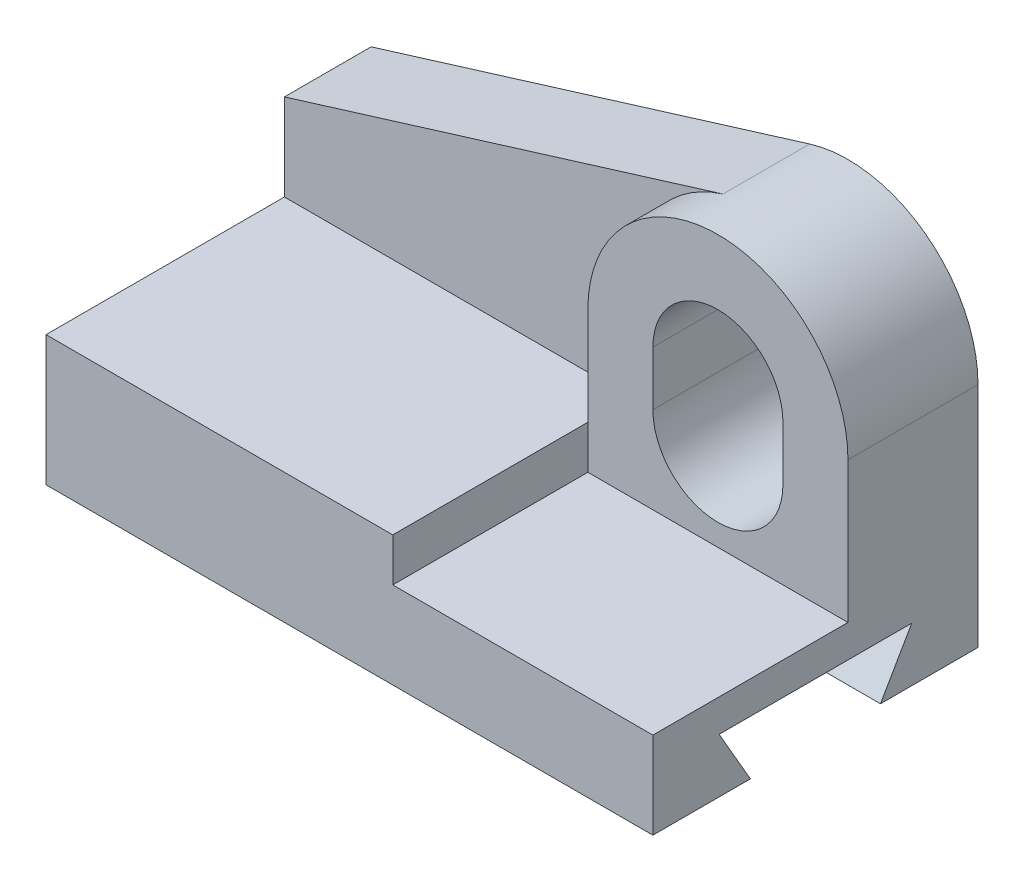
ISO-10303-21;
HEADER;
FILE_DESCRIPTION(('STEP AP214'),'2;1');
FILE_NAME('part.step','',(''),(''),'','','');
FILE_SCHEMA(('AUTOMOTIVE_DESIGN { 1 0 10303 214 1 1 1 1 }'));
ENDSEC;
DATA;
#1=APPLICATION_CONTEXT('core data for automotive mechanical design processes');
#2=APPLICATION_PROTOCOL_DEFINITION('international standard','automotive_design',2000,#1);
#3=PRODUCT_CONTEXT('',#1,'mechanical');
#4=PRODUCT('Part','Part','',(#3));
#5=PRODUCT_RELATED_PRODUCT_CATEGORY('part','',(#4));
#6=PRODUCT_DEFINITION_FORMATION('','',#4);
#7=PRODUCT_DEFINITION_CONTEXT('part definition',#1,'design');
#8=PRODUCT_DEFINITION('design','',#6,#7);
#9=PRODUCT_DEFINITION_SHAPE('','',#8);
#10=(LENGTH_UNIT() NAMED_UNIT(*) SI_UNIT(.MILLI.,.METRE.));
#11=(NAMED_UNIT(*) PLANE_ANGLE_UNIT() SI_UNIT($,.RADIAN.));
#12=(NAMED_UNIT(*) SI_UNIT($,.STERADIAN.) SOLID_ANGLE_UNIT());
#13=UNCERTAINTY_MEASURE_WITH_UNIT(LENGTH_MEASURE(1.E-05),#10,'distance_accuracy_value','');
#14=(GEOMETRIC_REPRESENTATION_CONTEXT(3) GLOBAL_UNCERTAINTY_ASSIGNED_CONTEXT((#13)) GLOBAL_UNIT_ASSIGNED_CONTEXT((#10,
#11,#12)) REPRESENTATION_CONTEXT('',''));
#15=CARTESIAN_POINT('',(0.,0.,0.));
#16=DIRECTION('',(0.,0.,1.));
#17=DIRECTION('',(1.,0.,0.));
#18=AXIS2_PLACEMENT_3D('',#15,#16,#17);
#19=CARTESIAN_POINT('',(0.,0.,30.));
#20=DIRECTION('',(0.,1.,0.));
#21=DIRECTION('',(0.,0.,1.));
#22=AXIS2_PLACEMENT_3D('',#19,#20,#21);
#23=PLANE('',#22);
#24=DIRECTION('',(0.,0.,-1.));
#25=VECTOR('',#24,1.);
#26=CARTESIAN_POINT('',(56.,0.,30.));
#27=LINE('',#26,#25);
#28=CARTESIAN_POINT('',(56.,0.,9.));
#29=VERTEX_POINT('',#28);
#30=CARTESIAN_POINT('',(56.,0.,0.));
#31=VERTEX_POINT('',#30);
#32=EDGE_CURVE('E198',#29,#31,#27,.T.);
#33=ORIENTED_EDGE('',*,*,#32,.F.);
#34=DIRECTION('',(-1.,0.,0.));
#35=VECTOR('',#34,1.);
#36=CARTESIAN_POINT('',(56.,0.,9.));
#37=LINE('',#36,#35);
#38=CARTESIAN_POINT('',(0.,0.,9.));
#39=VERTEX_POINT('',#38);
#40=EDGE_CURVE('E245',#29,#39,#37,.T.);
#41=ORIENTED_EDGE('',*,*,#40,.T.);
#42=DIRECTION('',(0.,0.,-1.));
#43=VECTOR('',#42,1.);
#44=CARTESIAN_POINT('',(0.,0.,30.));
#45=LINE('',#44,#43);
#46=CARTESIAN_POINT('',(0.,0.,0.));
#47=VERTEX_POINT('',#46);
#48=EDGE_CURVE('E197',#39,#47,#45,.T.);
#49=ORIENTED_EDGE('',*,*,#48,.T.);
#50=DIRECTION('',(1.,0.,0.));
#51=VECTOR('',#50,1.);
#52=CARTESIAN_POINT('',(0.,0.,0.));
#53=LINE('',#52,#51);
#54=EDGE_CURVE('E332',#47,#31,#53,.T.);
#55=ORIENTED_EDGE('',*,*,#54,.T.);
#56=EDGE_LOOP('',(#33,#41,#49,#55));
#57=FACE_BOUND('',#56,.T.);
#58=ADVANCED_FACE('F41',(#57),#23,.F.);
#59=CARTESIAN_POINT('',(0.,8.,30.));
#60=DIRECTION('',(0.,1.,0.));
#61=DIRECTION('',(0.,0.,1.));
#62=AXIS2_PLACEMENT_3D('',#59,#60,#61);
#63=PLANE('',#62);
#64=DIRECTION('',(1.,0.,0.));
#65=VECTOR('',#64,1.);
#66=CARTESIAN_POINT('',(0.,8.,12.));
#67=LINE('',#66,#65);
#68=CARTESIAN_POINT('',(32.,8.,12.));
#69=VERTEX_POINT('',#68);
#70=CARTESIAN_POINT('',(56.,8.,12.));
#71=VERTEX_POINT('',#70);
#72=EDGE_CURVE('E229',#69,#71,#67,.T.);
#73=ORIENTED_EDGE('',*,*,#72,.F.);
#74=DIRECTION('',(0.,0.,-1.));
#75=VECTOR('',#74,1.);
#76=CARTESIAN_POINT('',(32.,8.,30.));
#77=LINE('',#76,#75);
#78=CARTESIAN_POINT('',(32.,8.,30.));
#79=VERTEX_POINT('',#78);
#80=EDGE_CURVE('E11',#79,#69,#77,.T.);
#81=ORIENTED_EDGE('',*,*,#80,.F.);
#82=DIRECTION('',(1.,0.,0.));
#83=VECTOR('',#82,1.);
#84=CARTESIAN_POINT('',(0.,8.,30.));
#85=LINE('',#84,#83);
#86=CARTESIAN_POINT('',(56.,8.,30.));
#87=VERTEX_POINT('',#86);
#88=EDGE_CURVE('E312',#79,#87,#85,.T.);
#89=ORIENTED_EDGE('',*,*,#88,.T.);
#90=DIRECTION('',(0.,0.,-1.));
#91=VECTOR('',#90,1.);
#92=CARTESIAN_POINT('',(56.,8.,30.));
#93=LINE('',#92,#91);
#94=EDGE_CURVE('E203',#87,#71,#93,.T.);
#95=ORIENTED_EDGE('',*,*,#94,.T.);
#96=EDGE_LOOP('',(#73,#81,#89,#95));
#97=FACE_BOUND('',#96,.T.);
#98=ADVANCED_FACE('F43',(#97),#63,.T.);
#99=CARTESIAN_POINT('',(32.,0.,30.));
#100=DIRECTION('',(-1.,0.,0.));
#101=DIRECTION('',(0.,-1.,0.));
#102=AXIS2_PLACEMENT_3D('',#99,#100,#101);
#103=PLANE('',#102);
#104=ORIENTED_EDGE('',*,*,#80,.T.);
#105=DIRECTION('',(0.,1.,0.));
#106=VECTOR('',#105,1.);
#107=CARTESIAN_POINT('',(32.,0.,12.));
#108=LINE('',#107,#106);
#109=CARTESIAN_POINT('',(32.,12.,12.));
#110=VERTEX_POINT('',#109);
#111=EDGE_CURVE('E224',#69,#110,#108,.T.);
#112=ORIENTED_EDGE('',*,*,#111,.T.);
#113=DIRECTION('',(0.,0.,-1.));
#114=VECTOR('',#113,1.);
#115=CARTESIAN_POINT('',(32.,12.,30.));
#116=LINE('',#115,#114);
#117=CARTESIAN_POINT('',(32.,12.,30.));
#118=VERTEX_POINT('',#117);
#119=EDGE_CURVE('E50',#118,#110,#116,.T.);
#120=ORIENTED_EDGE('',*,*,#119,.F.);
#121=DIRECTION('',(0.,1.,0.));
#122=VECTOR('',#121,1.);
#123=CARTESIAN_POINT('',(32.,0.,30.));
#124=LINE('',#123,#122);
#125=EDGE_CURVE('E222',#79,#118,#124,.T.);
#126=ORIENTED_EDGE('',*,*,#125,.F.);
#127=EDGE_LOOP('',(#104,#112,#120,#126));
#128=FACE_BOUND('',#127,.T.);
#129=ADVANCED_FACE('F221',(#128),#103,.F.);
#130=CARTESIAN_POINT('',(0.,12.,30.));
#131=DIRECTION('',(0.,1.,0.));
#132=DIRECTION('',(0.,0.,1.));
#133=AXIS2_PLACEMENT_3D('',#130,#131,#132);
#134=PLANE('',#133);
#135=DIRECTION('',(1.,0.,0.));
#136=VECTOR('',#135,1.);
#137=CARTESIAN_POINT('',(0.,12.,8.));
#138=LINE('',#137,#136);
#139=CARTESIAN_POINT('',(0.,12.,8.));
#140=VERTEX_POINT('',#139);
#141=CARTESIAN_POINT('',(32.,12.,8.));
#142=VERTEX_POINT('',#141);
#143=EDGE_CURVE('E65',#140,#142,#138,.T.);
#144=ORIENTED_EDGE('',*,*,#143,.F.);
#145=DIRECTION('',(0.,0.,-1.));
#146=VECTOR('',#145,1.);
#147=CARTESIAN_POINT('',(0.,12.,30.));
#148=LINE('',#147,#146);
#149=CARTESIAN_POINT('',(0.,12.,30.));
#150=VERTEX_POINT('',#149);
#151=EDGE_CURVE('E208',#150,#140,#148,.T.);
#152=ORIENTED_EDGE('',*,*,#151,.F.);
#153=DIRECTION('',(1.,0.,0.));
#154=VECTOR('',#153,1.);
#155=CARTESIAN_POINT('',(0.,12.,30.));
#156=LINE('',#155,#154);
#157=EDGE_CURVE('E217',#150,#118,#156,.T.);
#158=ORIENTED_EDGE('',*,*,#157,.T.);
#159=ORIENTED_EDGE('',*,*,#119,.T.);
#160=DIRECTION('',(0.,0.,1.));
#161=VECTOR('',#160,1.);
#162=CARTESIAN_POINT('',(32.,12.,30.));
#163=LINE('',#162,#161);
#164=EDGE_CURVE('E215',#142,#110,#163,.T.);
#165=ORIENTED_EDGE('',*,*,#164,.F.);
#166=EDGE_LOOP('',(#144,#152,#158,#159,#165));
#167=FACE_BOUND('',#166,.T.);
#168=ADVANCED_FACE('F214',(#167),#134,.T.);
#169=CARTESIAN_POINT('',(0.,0.,30.));
#170=DIRECTION('',(-1.,0.,0.));
#171=DIRECTION('',(0.,0.,1.));
#172=AXIS2_PLACEMENT_3D('',#169,#170,#171);
#173=PLANE('',#172);
#174=DIRECTION('',(0.,-0.866025403784436,0.500000000000004));
#175=VECTOR('',#174,1.);
#176=CARTESIAN_POINT('',(0.,0.,9.));
#177=LINE('',#176,#175);
#178=CARTESIAN_POINT('',(0.,5.,6.11324865405184));
#179=VERTEX_POINT('',#178);
#180=EDGE_CURVE('E180',#179,#39,#177,.T.);
#181=ORIENTED_EDGE('',*,*,#180,.F.);
#182=DIRECTION('',(0.,0.,-1.));
#183=VECTOR('',#182,1.);
#184=CARTESIAN_POINT('',(0.,5.,6.11324865405184));
#185=LINE('',#184,#183);
#186=CARTESIAN_POINT('',(0.,5.,23.8867513459482));
#187=VERTEX_POINT('',#186);
#188=EDGE_CURVE('E382',#187,#179,#185,.T.);
#189=ORIENTED_EDGE('',*,*,#188,.F.);
#190=DIRECTION('',(0.,0.866025403784436,0.500000000000004));
#191=VECTOR('',#190,1.);
#192=CARTESIAN_POINT('',(0.,0.,21.));
#193=LINE('',#192,#191);
#194=CARTESIAN_POINT('',(0.,0.,21.));
#195=VERTEX_POINT('',#194);
#196=EDGE_CURVE('E386',#195,#187,#193,.T.);
#197=ORIENTED_EDGE('',*,*,#196,.F.);
#198=CARTESIAN_POINT('',(0.,0.,30.));
#199=VERTEX_POINT('',#198);
#200=EDGE_CURVE('E189',#199,#195,#45,.T.);
#201=ORIENTED_EDGE('',*,*,#200,.F.);
#202=DIRECTION('',(0.,1.,0.));
#203=VECTOR('',#202,1.);
#204=CARTESIAN_POINT('',(0.,0.,30.));
#205=LINE('',#204,#203);
#206=EDGE_CURVE('E321',#199,#150,#205,.T.);
#207=ORIENTED_EDGE('',*,*,#206,.T.);
#208=ORIENTED_EDGE('',*,*,#151,.T.);
#209=DIRECTION('',(0.,1.,0.));
#210=VECTOR('',#209,1.);
#211=CARTESIAN_POINT('',(0.,0.,8.));
#212=LINE('',#211,#210);
#213=CARTESIAN_POINT('',(0.,20.,8.));
#214=VERTEX_POINT('',#213);
#215=EDGE_CURVE('E290',#140,#214,#212,.T.);
#216=ORIENTED_EDGE('',*,*,#215,.T.);
#217=DIRECTION('',(0.,0.,-1.));
#218=VECTOR('',#217,1.);
#219=CARTESIAN_POINT('',(0.,20.,8.));
#220=LINE('',#219,#218);
#221=CARTESIAN_POINT('',(0.,20.,0.));
#222=VERTEX_POINT('',#221);
#223=EDGE_CURVE('E300',#214,#222,#220,.T.);
#224=ORIENTED_EDGE('',*,*,#223,.T.);
#225=DIRECTION('',(0.,1.,0.));
#226=VECTOR('',#225,1.);
#227=CARTESIAN_POINT('',(0.,0.,0.));
#228=LINE('',#227,#226);
#229=EDGE_CURVE('E311',#47,#222,#228,.T.);
#230=ORIENTED_EDGE('',*,*,#229,.F.);
#231=ORIENTED_EDGE('',*,*,#48,.F.);
#232=EDGE_LOOP('',(#181,#189,#197,#201,#207,#208,#216,#224,#230,#231));
#233=FACE_BOUND('',#232,.T.);
#234=ADVANCED_FACE('F399',(#233),#173,.T.);
#235=ORIENTED_EDGE('',*,*,#200,.T.);
#236=DIRECTION('',(-1.,0.,0.));
#237=VECTOR('',#236,1.);
#238=CARTESIAN_POINT('',(56.,0.,21.));
#239=LINE('',#238,#237);
#240=CARTESIAN_POINT('',(56.,0.,21.));
#241=VERTEX_POINT('',#240);
#242=EDGE_CURVE('E174',#241,#195,#239,.T.);
#243=ORIENTED_EDGE('',*,*,#242,.F.);
#244=CARTESIAN_POINT('',(56.,0.,30.));
#245=VERTEX_POINT('',#244);
#246=EDGE_CURVE('E187',#245,#241,#27,.T.);
#247=ORIENTED_EDGE('',*,*,#246,.F.);
#248=DIRECTION('',(1.,0.,0.));
#249=VECTOR('',#248,1.);
#250=CARTESIAN_POINT('',(0.,0.,30.));
#251=LINE('',#250,#249);
#252=EDGE_CURVE('E325',#199,#245,#251,.T.);
#253=ORIENTED_EDGE('',*,*,#252,.F.);
#254=EDGE_LOOP('',(#235,#243,#247,#253));
#255=FACE_BOUND('',#254,.T.);
#256=ADVANCED_FACE('F185',(#255),#23,.F.);
#257=CARTESIAN_POINT('',(56.,0.,30.));
#258=DIRECTION('',(-1.,0.,0.));
#259=DIRECTION('',(0.,0.,1.));
#260=AXIS2_PLACEMENT_3D('',#257,#258,#259);
#261=PLANE('',#260);
#262=DIRECTION('',(0.,0.,-1.));
#263=VECTOR('',#262,1.);
#264=CARTESIAN_POINT('',(56.,5.,6.11324865405184));
#265=LINE('',#264,#263);
#266=CARTESIAN_POINT('',(56.,5.,23.8867513459482));
#267=VERTEX_POINT('',#266);
#268=CARTESIAN_POINT('',(56.,5.,6.11324865405184));
#269=VERTEX_POINT('',#268);
#270=EDGE_CURVE('E57',#267,#269,#265,.T.);
#271=ORIENTED_EDGE('',*,*,#270,.T.);
#272=DIRECTION('',(0.,-0.866025403784436,0.500000000000004));
#273=VECTOR('',#272,1.);
#274=CARTESIAN_POINT('',(56.,0.,9.));
#275=LINE('',#274,#273);
#276=EDGE_CURVE('E191',#269,#29,#275,.T.);
#277=ORIENTED_EDGE('',*,*,#276,.T.);
#278=ORIENTED_EDGE('',*,*,#32,.T.);
#279=DIRECTION('',(0.,1.,0.));
#280=VECTOR('',#279,1.);
#281=CARTESIAN_POINT('',(56.,0.,0.));
#282=LINE('',#281,#280);
#283=CARTESIAN_POINT('',(56.,21.,0.));
#284=VERTEX_POINT('',#283);
#285=EDGE_CURVE('E316',#31,#284,#282,.T.);
#286=ORIENTED_EDGE('',*,*,#285,.T.);
#287=DIRECTION('',(0.,0.,-1.));
#288=VECTOR('',#287,1.);
#289=CARTESIAN_POINT('',(56.,21.,12.));
#290=LINE('',#289,#288);
#291=CARTESIAN_POINT('',(56.,21.,12.));
#292=VERTEX_POINT('',#291);
#293=EDGE_CURVE('E264',#292,#284,#290,.T.);
#294=ORIENTED_EDGE('',*,*,#293,.F.);
#295=DIRECTION('',(0.,1.,0.));
#296=VECTOR('',#295,1.);
#297=CARTESIAN_POINT('',(56.,0.,12.));
#298=LINE('',#297,#296);
#299=EDGE_CURVE('E353',#71,#292,#298,.T.);
#300=ORIENTED_EDGE('',*,*,#299,.F.);
#301=ORIENTED_EDGE('',*,*,#94,.F.);
#302=DIRECTION('',(0.,1.,0.));
#303=VECTOR('',#302,1.);
#304=CARTESIAN_POINT('',(56.,0.,30.));
#305=LINE('',#304,#303);
#306=EDGE_CURVE('E195',#245,#87,#305,.T.);
#307=ORIENTED_EDGE('',*,*,#306,.F.);
#308=ORIENTED_EDGE('',*,*,#246,.T.);
#309=DIRECTION('',(0.,0.866025403784436,0.500000000000004));
#310=VECTOR('',#309,1.);
#311=CARTESIAN_POINT('',(56.,0.,21.));
#312=LINE('',#311,#310);
#313=EDGE_CURVE('E170',#241,#267,#312,.T.);
#314=ORIENTED_EDGE('',*,*,#313,.T.);
#315=EDGE_LOOP('',(#271,#277,#278,#286,#294,#300,#301,#307,#308,#314));
#316=FACE_BOUND('',#315,.T.);
#317=ADVANCED_FACE('F193',(#316),#261,.F.);
#318=CARTESIAN_POINT('',(0.,0.,30.));
#319=DIRECTION('',(0.,0.,1.));
#320=DIRECTION('',(1.,0.,0.));
#321=AXIS2_PLACEMENT_3D('',#318,#319,#320);
#322=PLANE('',#321);
#323=ORIENTED_EDGE('',*,*,#88,.F.);
#324=ORIENTED_EDGE('',*,*,#125,.T.);
#325=ORIENTED_EDGE('',*,*,#157,.F.);
#326=ORIENTED_EDGE('',*,*,#206,.F.);
#327=ORIENTED_EDGE('',*,*,#252,.T.);
#328=ORIENTED_EDGE('',*,*,#306,.T.);
#329=EDGE_LOOP('',(#323,#324,#325,#326,#327,#328));
#330=FACE_BOUND('',#329,.T.);
#331=ADVANCED_FACE('F434',(#330),#322,.T.);
#332=CARTESIAN_POINT('',(0.,0.,0.));
#333=DIRECTION('',(0.,0.,1.));
#334=DIRECTION('',(1.,0.,0.));
#335=AXIS2_PLACEMENT_3D('',#332,#333,#334);
#336=PLANE('',#335);
#337=CARTESIAN_POINT('',(44.,21.,0.));
#338=DIRECTION('',(0.,0.,1.));
#339=DIRECTION('',(1.,0.,0.));
#340=AXIS2_PLACEMENT_3D('',#337,#338,#339);
#341=CIRCLE('',#340,12.);
#342=CARTESIAN_POINT('',(40.466636051299,32.4680137428423,0.));
#343=VERTEX_POINT('',#342);
#344=EDGE_CURVE('E257',#284,#343,#341,.T.);
#345=ORIENTED_EDGE('',*,*,#344,.F.);
#346=ORIENTED_EDGE('',*,*,#285,.F.);
#347=ORIENTED_EDGE('',*,*,#54,.F.);
#348=ORIENTED_EDGE('',*,*,#229,.T.);
#349=DIRECTION('',(0.955667811903527,0.29444699572508,0.));
#350=VECTOR('',#349,1.);
#351=CARTESIAN_POINT('',(-5.62787032252309,18.2660193341695,0.));
#352=LINE('',#351,#350);
#353=EDGE_CURVE('E281',#222,#343,#352,.T.);
#354=ORIENTED_EDGE('',*,*,#353,.T.);
#355=EDGE_LOOP('',(#345,#346,#347,#348,#354));
#356=FACE_BOUND('',#355,.T.);
#357=CARTESIAN_POINT('',(44.,16.,0.));
#358=DIRECTION('',(0.,0.,1.));
#359=DIRECTION('',(1.,0.,0.));
#360=AXIS2_PLACEMENT_3D('',#357,#358,#359);
#361=CIRCLE('',#360,6.00000000000001);
#362=CARTESIAN_POINT('',(38.,16.,0.));
#363=VERTEX_POINT('',#362);
#364=CARTESIAN_POINT('',(50.,16.,0.));
#365=VERTEX_POINT('',#364);
#366=EDGE_CURVE('E240',#363,#365,#361,.T.);
#367=ORIENTED_EDGE('',*,*,#366,.T.);
#368=DIRECTION('',(0.,-1.,0.));
#369=VECTOR('',#368,1.);
#370=CARTESIAN_POINT('',(50.,0.,0.));
#371=LINE('',#370,#369);
#372=CARTESIAN_POINT('',(50.,21.,0.));
#373=VERTEX_POINT('',#372);
#374=EDGE_CURVE('E253',#373,#365,#371,.T.);
#375=ORIENTED_EDGE('',*,*,#374,.F.);
#376=CARTESIAN_POINT('',(44.,21.,0.));
#377=DIRECTION('',(0.,0.,1.));
#378=DIRECTION('',(1.,0.,0.));
#379=AXIS2_PLACEMENT_3D('',#376,#377,#378);
#380=CIRCLE('',#379,6.00000000000001);
#381=CARTESIAN_POINT('',(38.,21.,0.));
#382=VERTEX_POINT('',#381);
#383=EDGE_CURVE('E249',#373,#382,#380,.T.);
#384=ORIENTED_EDGE('',*,*,#383,.T.);
#385=DIRECTION('',(0.,-1.,0.));
#386=VECTOR('',#385,1.);
#387=CARTESIAN_POINT('',(38.,0.,0.));
#388=LINE('',#387,#386);
#389=EDGE_CURVE('E244',#382,#363,#388,.T.);
#390=ORIENTED_EDGE('',*,*,#389,.T.);
#391=EDGE_LOOP('',(#367,#375,#384,#390));
#392=FACE_BOUND('',#391,.T.);
#393=ADVANCED_FACE('F344',(#356,#392),#336,.F.);
#394=CARTESIAN_POINT('',(-5.62787032252309,18.2660193341695,8.));
#395=DIRECTION('',(-0.29444699572508,0.955667811903527,0.));
#396=DIRECTION('',(-0.955667811903527,-0.29444699572508,0.));
#397=AXIS2_PLACEMENT_3D('',#394,#395,#396);
#398=PLANE('',#397);
#399=ORIENTED_EDGE('',*,*,#353,.F.);
#400=ORIENTED_EDGE('',*,*,#223,.F.);
#401=DIRECTION('',(0.955667811903527,0.29444699572508,0.));
#402=VECTOR('',#401,1.);
#403=CARTESIAN_POINT('',(-5.62787032252309,18.2660193341695,8.));
#404=LINE('',#403,#402);
#405=CARTESIAN_POINT('',(40.466636051299,32.4680137428423,8.));
#406=VERTEX_POINT('',#405);
#407=EDGE_CURVE('E286',#214,#406,#404,.T.);
#408=ORIENTED_EDGE('',*,*,#407,.T.);
#409=DIRECTION('',(0.,0.,-1.));
#410=VECTOR('',#409,1.);
#411=CARTESIAN_POINT('',(40.466636051299,32.4680137428423,8.));
#412=LINE('',#411,#410);
#413=EDGE_CURVE('E307',#406,#343,#412,.T.);
#414=ORIENTED_EDGE('',*,*,#413,.T.);
#415=EDGE_LOOP('',(#399,#400,#408,#414));
#416=FACE_BOUND('',#415,.T.);
#417=ADVANCED_FACE('F403',(#416),#398,.T.);
#418=CARTESIAN_POINT('',(0.,0.,8.));
#419=DIRECTION('',(0.,0.,1.));
#420=DIRECTION('',(1.,0.,0.));
#421=AXIS2_PLACEMENT_3D('',#418,#419,#420);
#422=PLANE('',#421);
#423=CARTESIAN_POINT('',(44.,21.,8.));
#424=DIRECTION('',(0.,0.,1.));
#425=DIRECTION('',(1.,0.,0.));
#426=AXIS2_PLACEMENT_3D('',#423,#424,#425);
#427=CIRCLE('',#426,12.);
#428=CARTESIAN_POINT('',(32.,21.,8.));
#429=VERTEX_POINT('',#428);
#430=EDGE_CURVE('E282',#406,#429,#427,.T.);
#431=ORIENTED_EDGE('',*,*,#430,.F.);
#432=ORIENTED_EDGE('',*,*,#407,.F.);
#433=ORIENTED_EDGE('',*,*,#215,.F.);
#434=ORIENTED_EDGE('',*,*,#143,.T.);
#435=DIRECTION('',(0.,1.,0.));
#436=VECTOR('',#435,1.);
#437=CARTESIAN_POINT('',(32.,0.,8.));
#438=LINE('',#437,#436);
#439=EDGE_CURVE('E296',#142,#429,#438,.T.);
#440=ORIENTED_EDGE('',*,*,#439,.T.);
#441=EDGE_LOOP('',(#431,#432,#433,#434,#440));
#442=FACE_BOUND('',#441,.T.);
#443=ADVANCED_FACE('F406',(#442),#422,.T.);
#444=CARTESIAN_POINT('',(44.,21.,12.));
#445=DIRECTION('',(0.,0.,-1.));
#446=DIRECTION('',(-1.,0.,0.));
#447=AXIS2_PLACEMENT_3D('',#444,#445,#446);
#448=CYLINDRICAL_SURFACE('',#447,12.);
#449=ORIENTED_EDGE('',*,*,#344,.T.);
#450=ORIENTED_EDGE('',*,*,#413,.F.);
#451=ORIENTED_EDGE('',*,*,#430,.T.);
#452=DIRECTION('',(0.,0.,-1.));
#453=VECTOR('',#452,1.);
#454=CARTESIAN_POINT('',(32.,21.,12.));
#455=LINE('',#454,#453);
#456=CARTESIAN_POINT('',(32.,21.,12.));
#457=VERTEX_POINT('',#456);
#458=EDGE_CURVE('E261',#457,#429,#455,.T.);
#459=ORIENTED_EDGE('',*,*,#458,.F.);
#460=CARTESIAN_POINT('',(44.,21.,12.));
#461=DIRECTION('',(0.,0.,1.));
#462=DIRECTION('',(1.,0.,0.));
#463=AXIS2_PLACEMENT_3D('',#460,#461,#462);
#464=CIRCLE('',#463,12.);
#465=EDGE_CURVE('E236',#292,#457,#464,.T.);
#466=ORIENTED_EDGE('',*,*,#465,.F.);
#467=ORIENTED_EDGE('',*,*,#293,.T.);
#468=EDGE_LOOP('',(#449,#450,#451,#459,#466,#467));
#469=FACE_BOUND('',#468,.T.);
#470=ADVANCED_FACE('F348',(#469),#448,.T.);
#471=CARTESIAN_POINT('',(32.,0.,12.));
#472=DIRECTION('',(-1.,0.,0.));
#473=DIRECTION('',(0.,-1.,0.));
#474=AXIS2_PLACEMENT_3D('',#471,#472,#473);
#475=PLANE('',#474);
#476=ORIENTED_EDGE('',*,*,#439,.F.);
#477=ORIENTED_EDGE('',*,*,#164,.T.);
#478=EDGE_CURVE('E230',#110,#457,#108,.T.);
#479=ORIENTED_EDGE('',*,*,#478,.T.);
#480=ORIENTED_EDGE('',*,*,#458,.T.);
#481=EDGE_LOOP('',(#476,#477,#479,#480));
#482=FACE_BOUND('',#481,.T.);
#483=ADVANCED_FACE('F408',(#482),#475,.T.);
#484=CARTESIAN_POINT('',(44.,16.,12.));
#485=DIRECTION('',(0.,0.,-1.));
#486=DIRECTION('',(-1.,0.,0.));
#487=AXIS2_PLACEMENT_3D('',#484,#485,#486);
#488=CYLINDRICAL_SURFACE('',#487,6.00000000000001);
#489=ORIENTED_EDGE('',*,*,#366,.F.);
#490=DIRECTION('',(0.,0.,-1.));
#491=VECTOR('',#490,1.);
#492=CARTESIAN_POINT('',(38.,16.,12.));
#493=LINE('',#492,#491);
#494=CARTESIAN_POINT('',(38.,16.,12.));
#495=VERTEX_POINT('',#494);
#496=EDGE_CURVE('E265',#495,#363,#493,.T.);
#497=ORIENTED_EDGE('',*,*,#496,.F.);
#498=CARTESIAN_POINT('',(44.,16.,12.));
#499=DIRECTION('',(0.,0.,1.));
#500=DIRECTION('',(1.,0.,0.));
#501=AXIS2_PLACEMENT_3D('',#498,#499,#500);
#502=CIRCLE('',#501,6.00000000000001);
#503=CARTESIAN_POINT('',(50.,16.,12.));
#504=VERTEX_POINT('',#503);
#505=EDGE_CURVE('E260',#495,#504,#502,.T.);
#506=ORIENTED_EDGE('',*,*,#505,.T.);
#507=DIRECTION('',(0.,0.,-1.));
#508=VECTOR('',#507,1.);
#509=CARTESIAN_POINT('',(50.,16.,12.));
#510=LINE('',#509,#508);
#511=EDGE_CURVE('E234',#504,#365,#510,.T.);
#512=ORIENTED_EDGE('',*,*,#511,.T.);
#513=EDGE_LOOP('',(#489,#497,#506,#512));
#514=FACE_BOUND('',#513,.T.);
#515=ADVANCED_FACE('F410',(#514),#488,.F.);
#516=CARTESIAN_POINT('',(38.,0.,12.));
#517=DIRECTION('',(1.,0.,0.));
#518=DIRECTION('',(0.,0.,-1.));
#519=AXIS2_PLACEMENT_3D('',#516,#517,#518);
#520=PLANE('',#519);
#521=ORIENTED_EDGE('',*,*,#389,.F.);
#522=DIRECTION('',(0.,0.,-1.));
#523=VECTOR('',#522,1.);
#524=CARTESIAN_POINT('',(38.,21.,12.));
#525=LINE('',#524,#523);
#526=CARTESIAN_POINT('',(38.,21.,12.));
#527=VERTEX_POINT('',#526);
#528=EDGE_CURVE('E274',#527,#382,#525,.T.);
#529=ORIENTED_EDGE('',*,*,#528,.F.);
#530=DIRECTION('',(0.,-1.,0.));
#531=VECTOR('',#530,1.);
#532=CARTESIAN_POINT('',(38.,0.,12.));
#533=LINE('',#532,#531);
#534=EDGE_CURVE('E365',#527,#495,#533,.T.);
#535=ORIENTED_EDGE('',*,*,#534,.T.);
#536=ORIENTED_EDGE('',*,*,#496,.T.);
#537=EDGE_LOOP('',(#521,#529,#535,#536));
#538=FACE_BOUND('',#537,.T.);
#539=ADVANCED_FACE('F416',(#538),#520,.T.);
#540=CARTESIAN_POINT('',(44.,21.,12.));
#541=DIRECTION('',(0.,0.,-1.));
#542=DIRECTION('',(-1.,0.,0.));
#543=AXIS2_PLACEMENT_3D('',#540,#541,#542);
#544=CYLINDRICAL_SURFACE('',#543,6.00000000000001);
#545=ORIENTED_EDGE('',*,*,#383,.F.);
#546=DIRECTION('',(0.,0.,-1.));
#547=VECTOR('',#546,1.);
#548=CARTESIAN_POINT('',(50.,21.,12.));
#549=LINE('',#548,#547);
#550=CARTESIAN_POINT('',(50.,21.,12.));
#551=VERTEX_POINT('',#550);
#552=EDGE_CURVE('E271',#551,#373,#549,.T.);
#553=ORIENTED_EDGE('',*,*,#552,.F.);
#554=CARTESIAN_POINT('',(44.,21.,12.));
#555=DIRECTION('',(0.,0.,1.));
#556=DIRECTION('',(1.,0.,0.));
#557=AXIS2_PLACEMENT_3D('',#554,#555,#556);
#558=CIRCLE('',#557,6.00000000000001);
#559=EDGE_CURVE('E359',#551,#527,#558,.T.);
#560=ORIENTED_EDGE('',*,*,#559,.T.);
#561=ORIENTED_EDGE('',*,*,#528,.T.);
#562=EDGE_LOOP('',(#545,#553,#560,#561));
#563=FACE_BOUND('',#562,.T.);
#564=ADVANCED_FACE('F502',(#563),#544,.F.);
#565=CARTESIAN_POINT('',(50.,0.,12.));
#566=DIRECTION('',(1.,0.,0.));
#567=DIRECTION('',(0.,0.,-1.));
#568=AXIS2_PLACEMENT_3D('',#565,#566,#567);
#569=PLANE('',#568);
#570=ORIENTED_EDGE('',*,*,#374,.T.);
#571=ORIENTED_EDGE('',*,*,#511,.F.);
#572=DIRECTION('',(0.,-1.,0.));
#573=VECTOR('',#572,1.);
#574=CARTESIAN_POINT('',(50.,0.,12.));
#575=LINE('',#574,#573);
#576=EDGE_CURVE('E357',#551,#504,#575,.T.);
#577=ORIENTED_EDGE('',*,*,#576,.F.);
#578=ORIENTED_EDGE('',*,*,#552,.T.);
#579=EDGE_LOOP('',(#570,#571,#577,#578));
#580=FACE_BOUND('',#579,.T.);
#581=ADVANCED_FACE('F512',(#580),#569,.F.);
#582=CARTESIAN_POINT('',(0.,0.,12.));
#583=DIRECTION('',(0.,0.,1.));
#584=DIRECTION('',(1.,0.,0.));
#585=AXIS2_PLACEMENT_3D('',#582,#583,#584);
#586=PLANE('',#585);
#587=ORIENTED_EDGE('',*,*,#505,.F.);
#588=ORIENTED_EDGE('',*,*,#534,.F.);
#589=ORIENTED_EDGE('',*,*,#559,.F.);
#590=ORIENTED_EDGE('',*,*,#576,.T.);
#591=EDGE_LOOP('',(#587,#588,#589,#590));
#592=FACE_BOUND('',#591,.T.);
#593=ORIENTED_EDGE('',*,*,#299,.T.);
#594=ORIENTED_EDGE('',*,*,#465,.T.);
#595=ORIENTED_EDGE('',*,*,#478,.F.);
#596=ORIENTED_EDGE('',*,*,#111,.F.);
#597=ORIENTED_EDGE('',*,*,#72,.T.);
#598=EDGE_LOOP('',(#593,#594,#595,#596,#597));
#599=FACE_BOUND('',#598,.T.);
#600=ADVANCED_FACE('F354',(#592,#599),#586,.T.);
#601=CARTESIAN_POINT('',(56.,0.,9.));
#602=DIRECTION('',(0.,-0.500000000000004,-0.866025403784436));
#603=DIRECTION('',(0.,0.866025403784436,-0.500000000000004));
#604=AXIS2_PLACEMENT_3D('',#601,#602,#603);
#605=PLANE('',#604);
#606=ORIENTED_EDGE('',*,*,#180,.T.);
#607=ORIENTED_EDGE('',*,*,#40,.F.);
#608=ORIENTED_EDGE('',*,*,#276,.F.);
#609=DIRECTION('',(-1.,0.,0.));
#610=VECTOR('',#609,1.);
#611=CARTESIAN_POINT('',(56.,5.,6.11324865405184));
#612=LINE('',#611,#610);
#613=EDGE_CURVE('E374',#269,#179,#612,.T.);
#614=ORIENTED_EDGE('',*,*,#613,.T.);
#615=EDGE_LOOP('',(#606,#607,#608,#614));
#616=FACE_BOUND('',#615,.T.);
#617=ADVANCED_FACE('F530',(#616),#605,.F.);
#618=CARTESIAN_POINT('',(56.,5.,6.11324865405184));
#619=DIRECTION('',(0.,1.,0.));
#620=DIRECTION('',(0.,0.,1.));
#621=AXIS2_PLACEMENT_3D('',#618,#619,#620);
#622=PLANE('',#621);
#623=ORIENTED_EDGE('',*,*,#188,.T.);
#624=ORIENTED_EDGE('',*,*,#613,.F.);
#625=ORIENTED_EDGE('',*,*,#270,.F.);
#626=DIRECTION('',(-1.,0.,0.));
#627=VECTOR('',#626,1.);
#628=CARTESIAN_POINT('',(56.,5.,23.8867513459482));
#629=LINE('',#628,#627);
#630=EDGE_CURVE('E176',#267,#187,#629,.T.);
#631=ORIENTED_EDGE('',*,*,#630,.T.);
#632=EDGE_LOOP('',(#623,#624,#625,#631));
#633=FACE_BOUND('',#632,.T.);
#634=ADVANCED_FACE('F558',(#633),#622,.F.);
#635=CARTESIAN_POINT('',(56.,0.,21.));
#636=DIRECTION('',(0.,-0.500000000000004,0.866025403784436));
#637=DIRECTION('',(0.,-0.866025403784436,-0.500000000000004));
#638=AXIS2_PLACEMENT_3D('',#635,#636,#637);
#639=PLANE('',#638);
#640=ORIENTED_EDGE('',*,*,#196,.T.);
#641=ORIENTED_EDGE('',*,*,#630,.F.);
#642=ORIENTED_EDGE('',*,*,#313,.F.);
#643=ORIENTED_EDGE('',*,*,#242,.T.);
#644=EDGE_LOOP('',(#640,#641,#642,#643));
#645=FACE_BOUND('',#644,.T.);
#646=ADVANCED_FACE('F173',(#645),#639,.F.);
#647=CLOSED_SHELL('',(#58,#98,#129,#168,#234,#256,#317,#331,#393,#417,#443,#470,#483,#515,#539,
#564,#581,#600,#617,#634,#646));
#648=MANIFOLD_SOLID_BREP('B2',#647);
#649=ADVANCED_BREP_SHAPE_REPRESENTATION('',(#18,#648),#14);
#650=SHAPE_DEFINITION_REPRESENTATION(#9,#649);
ENDSEC;
END-ISO-10303-21;
